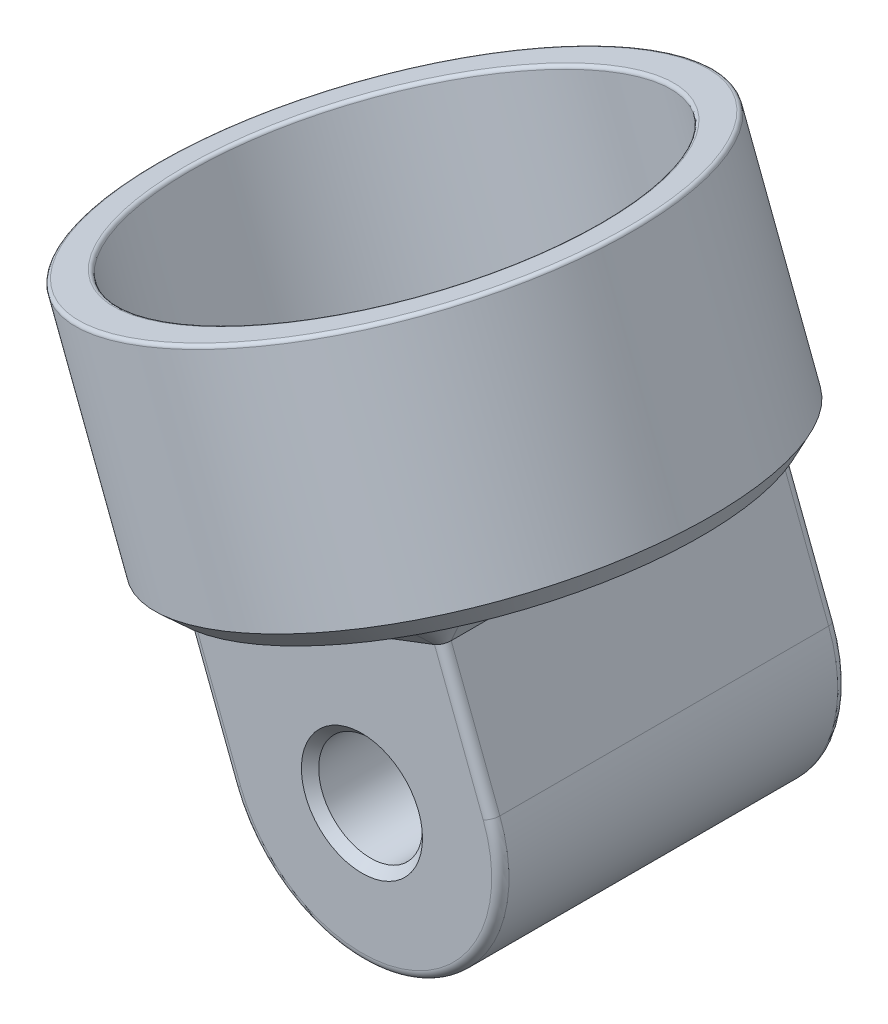
ISO-10303-21;
HEADER;
FILE_DESCRIPTION(('STEP AP214'),'2;1');
FILE_NAME('part.step','',(''),(''),'','','');
FILE_SCHEMA(('AUTOMOTIVE_DESIGN { 1 0 10303 214 1 1 1 1 }'));
ENDSEC;
DATA;
#1=APPLICATION_CONTEXT('core data for automotive mechanical design processes');
#2=APPLICATION_PROTOCOL_DEFINITION('international standard','automotive_design',2000,#1);
#3=PRODUCT_CONTEXT('',#1,'mechanical');
#4=PRODUCT('Part','Part','',(#3));
#5=PRODUCT_RELATED_PRODUCT_CATEGORY('part','',(#4));
#6=PRODUCT_DEFINITION_FORMATION('','',#4);
#7=PRODUCT_DEFINITION_CONTEXT('part definition',#1,'design');
#8=PRODUCT_DEFINITION('design','',#6,#7);
#9=PRODUCT_DEFINITION_SHAPE('','',#8);
#10=(LENGTH_UNIT() NAMED_UNIT(*) SI_UNIT(.MILLI.,.METRE.));
#11=(NAMED_UNIT(*) PLANE_ANGLE_UNIT() SI_UNIT($,.RADIAN.));
#12=(NAMED_UNIT(*) SI_UNIT($,.STERADIAN.) SOLID_ANGLE_UNIT());
#13=UNCERTAINTY_MEASURE_WITH_UNIT(LENGTH_MEASURE(1.E-05),#10,'distance_accuracy_value','');
#14=(GEOMETRIC_REPRESENTATION_CONTEXT(3) GLOBAL_UNCERTAINTY_ASSIGNED_CONTEXT((#13)) GLOBAL_UNIT_ASSIGNED_CONTEXT((#10,
#11,#12)) REPRESENTATION_CONTEXT('',''));
#15=CARTESIAN_POINT('',(0.,0.,0.));
#16=DIRECTION('',(0.,0.,1.));
#17=DIRECTION('',(1.,0.,0.));
#18=AXIS2_PLACEMENT_3D('',#15,#16,#17);
#19=CARTESIAN_POINT('',(98.3545557526425,58.5746602409925,0.));
#20=DIRECTION('',(-0.356881721547672,0.934149579470638,0.));
#21=DIRECTION('',(-0.934149579470638,-0.356881721547672,0.));
#22=AXIS2_PLACEMENT_3D('',#19,#20,#21);
#23=PLANE('',#22);
#24=CARTESIAN_POINT('',(98.3545557526429,58.5746602409927,0.));
#25=DIRECTION('',(-0.356881721547672,0.934149579470638,0.));
#26=DIRECTION('',(-0.934149579470638,-0.356881721547672,0.));
#27=AXIS2_PLACEMENT_3D('',#24,#25,#26);
#28=CIRCLE('',#27,13.6999999999999);
#29=CARTESIAN_POINT('',(85.5567065138952,53.6853806557896,0.));
#30=VERTEX_POINT('',#29);
#31=EDGE_CURVE('E239',#30,#30,#28,.F.);
#32=ORIENTED_EDGE('',*,*,#31,.T.);
#33=EDGE_LOOP('',(#32));
#34=FACE_BOUND('',#33,.T.);
#35=DIRECTION('',(0.934149579470638,0.356881721547672,0.));
#36=VECTOR('',#35,1.);
#37=CARTESIAN_POINT('',(98.3545557526425,58.5746602409925,11.));
#38=LINE('',#37,#36);
#39=CARTESIAN_POINT('',(91.3484339066134,55.8980473293853,10.9999999999999));
#40=VERTEX_POINT('',#39);
#41=CARTESIAN_POINT('',(105.360677598673,61.2512731526003,11.));
#42=VERTEX_POINT('',#41);
#43=EDGE_CURVE('E234',#40,#42,#38,.T.);
#44=ORIENTED_EDGE('',*,*,#43,.T.);
#45=CARTESIAN_POINT('',(105.360677598673,61.2512731526003,9.5));
#46=DIRECTION('',(-0.356881721547672,0.934149579470638,0.));
#47=DIRECTION('',(-0.934149579470638,-0.356881721547672,0.));
#48=AXIS2_PLACEMENT_3D('',#45,#46,#47);
#49=CIRCLE('',#48,1.49999999999995);
#50=CARTESIAN_POINT('',(106.761901967879,61.7865957349218,9.5));
#51=VERTEX_POINT('',#50);
#52=EDGE_CURVE('E236',#42,#51,#49,.T.);
#53=ORIENTED_EDGE('',*,*,#52,.T.);
#54=DIRECTION('',(0.,0.,-1.));
#55=VECTOR('',#54,1.);
#56=CARTESIAN_POINT('',(106.761901967879,61.7865957349218,0.));
#57=LINE('',#56,#55);
#58=CARTESIAN_POINT('',(106.761901967879,61.7865957349218,-9.5));
#59=VERTEX_POINT('',#58);
#60=EDGE_CURVE('E222',#51,#59,#57,.T.);
#61=ORIENTED_EDGE('',*,*,#60,.T.);
#62=CARTESIAN_POINT('',(105.360677598673,61.2512731526003,-9.5));
#63=DIRECTION('',(-0.356881721547672,0.934149579470638,0.));
#64=DIRECTION('',(-0.934149579470638,-0.356881721547672,0.));
#65=AXIS2_PLACEMENT_3D('',#62,#63,#64);
#66=CIRCLE('',#65,1.49999999999998);
#67=CARTESIAN_POINT('',(105.360677598673,61.2512731526003,-11.));
#68=VERTEX_POINT('',#67);
#69=EDGE_CURVE('E224',#59,#68,#66,.T.);
#70=ORIENTED_EDGE('',*,*,#69,.T.);
#71=DIRECTION('',(-0.934149579470638,-0.356881721547672,0.));
#72=VECTOR('',#71,1.);
#73=CARTESIAN_POINT('',(91.3484339066134,55.8980473293853,-11.));
#74=LINE('',#73,#72);
#75=CARTESIAN_POINT('',(91.3484339066134,55.8980473293853,-11.));
#76=VERTEX_POINT('',#75);
#77=EDGE_CURVE('E226',#68,#76,#74,.T.);
#78=ORIENTED_EDGE('',*,*,#77,.T.);
#79=CARTESIAN_POINT('',(91.3484339066134,55.8980473293853,-9.5));
#80=DIRECTION('',(-0.356881721547672,0.934149579470638,0.));
#81=DIRECTION('',(-0.934149579470638,-0.356881721547672,0.));
#82=AXIS2_PLACEMENT_3D('',#79,#80,#81);
#83=CIRCLE('',#82,1.49999999999998);
#84=CARTESIAN_POINT('',(89.9472095374074,55.3627247470638,-9.5));
#85=VERTEX_POINT('',#84);
#86=EDGE_CURVE('E228',#76,#85,#83,.T.);
#87=ORIENTED_EDGE('',*,*,#86,.T.);
#88=DIRECTION('',(0.,0.,1.));
#89=VECTOR('',#88,1.);
#90=CARTESIAN_POINT('',(89.9472095374075,55.3627247470638,0.));
#91=LINE('',#90,#89);
#92=CARTESIAN_POINT('',(89.9472095374075,55.3627247470638,9.5));
#93=VERTEX_POINT('',#92);
#94=EDGE_CURVE('E230',#85,#93,#91,.T.);
#95=ORIENTED_EDGE('',*,*,#94,.T.);
#96=CARTESIAN_POINT('',(91.3484339066134,55.8980473293853,9.5));
#97=DIRECTION('',(-0.356881721547672,0.934149579470638,0.));
#98=DIRECTION('',(-0.934149579470638,-0.356881721547672,0.));
#99=AXIS2_PLACEMENT_3D('',#96,#97,#98);
#100=CIRCLE('',#99,1.49999999999995);
#101=EDGE_CURVE('E232',#93,#40,#100,.T.);
#102=ORIENTED_EDGE('',*,*,#101,.T.);
#103=EDGE_LOOP('',(#44,#53,#61,#70,#78,#87,#95,#102));
#104=FACE_BOUND('',#103,.T.);
#105=ADVANCED_FACE('F45',(#34,#104),#23,.F.);
#106=CARTESIAN_POINT('',(94.0512696439094,47.4222619788342,-10.));
#107=DIRECTION('',(-0.934149579470634,-0.356881721547683,0.));
#108=DIRECTION('',(0.356881721547683,-0.934149579470634,0.));
#109=AXIS2_PLACEMENT_3D('',#106,#107,#108);
#110=PLANE('',#109);
#111=DIRECTION('',(0.356881721547683,-0.934149579470634,0.));
#112=VECTOR('',#111,1.);
#113=CARTESIAN_POINT('',(94.0512696439094,47.4222619788342,9.5));
#114=LINE('',#113,#112);
#115=CARTESIAN_POINT('',(94.0512696439094,47.4222619788342,9.5));
#116=VERTEX_POINT('',#115);
#117=CARTESIAN_POINT('',(91.2382408384257,54.7854568891408,9.5));
#118=VERTEX_POINT('',#117);
#119=EDGE_CURVE('E148',#116,#118,#114,.F.);
#120=ORIENTED_EDGE('',*,*,#119,.T.);
#121=DIRECTION('',(0.,0.,-1.));
#122=VECTOR('',#121,1.);
#123=CARTESIAN_POINT('',(91.2382408384257,54.7854568891408,-10.));
#124=LINE('',#123,#122);
#125=CARTESIAN_POINT('',(91.2382408384257,54.7854568891408,-9.5));
#126=VERTEX_POINT('',#125);
#127=EDGE_CURVE('E249',#118,#126,#124,.T.);
#128=ORIENTED_EDGE('',*,*,#127,.T.);
#129=DIRECTION('',(0.356881721547683,-0.934149579470634,0.));
#130=VECTOR('',#129,1.);
#131=CARTESIAN_POINT('',(94.0512696439094,47.4222619788342,-9.5));
#132=LINE('',#131,#130);
#133=CARTESIAN_POINT('',(94.0512696439094,47.4222619788342,-9.5));
#134=VERTEX_POINT('',#133);
#135=EDGE_CURVE('E180',#126,#134,#132,.T.);
#136=ORIENTED_EDGE('',*,*,#135,.T.);
#137=DIRECTION('',(0.,0.,1.));
#138=VECTOR('',#137,1.);
#139=CARTESIAN_POINT('',(94.0512696439094,47.4222619788342,-10.));
#140=LINE('',#139,#138);
#141=EDGE_CURVE('E143',#134,#116,#140,.T.);
#142=ORIENTED_EDGE('',*,*,#141,.T.);
#143=EDGE_LOOP('',(#120,#128,#136,#142));
#144=FACE_BOUND('',#143,.T.);
#145=ADVANCED_FACE('F328',(#144),#110,.T.);
#146=CARTESIAN_POINT('',(108.99766291544,53.1323695235971,-10.));
#147=DIRECTION('',(0.934149579470634,0.356881721547684,0.));
#148=DIRECTION('',(-0.356881721547684,0.934149579470634,0.));
#149=AXIS2_PLACEMENT_3D('',#146,#147,#148);
#150=PLANE('',#149);
#151=DIRECTION('',(-0.356881721547684,0.934149579470634,0.));
#152=VECTOR('',#151,1.);
#153=CARTESIAN_POINT('',(105.827752388408,61.4297140133742,-9.5));
#154=LINE('',#153,#152);
#155=CARTESIAN_POINT('',(108.99766291544,53.1323695235971,-9.5));
#156=VERTEX_POINT('',#155);
#157=CARTESIAN_POINT('',(106.184634109956,60.4955644339036,-9.5));
#158=VERTEX_POINT('',#157);
#159=EDGE_CURVE('E153',#156,#158,#154,.T.);
#160=ORIENTED_EDGE('',*,*,#159,.T.);
#161=DIRECTION('',(0.,0.,1.));
#162=VECTOR('',#161,1.);
#163=CARTESIAN_POINT('',(106.184634109956,60.4955644339036,-10.));
#164=LINE('',#163,#162);
#165=CARTESIAN_POINT('',(106.184634109956,60.4955644339036,9.5));
#166=VERTEX_POINT('',#165);
#167=EDGE_CURVE('E13',#158,#166,#164,.T.);
#168=ORIENTED_EDGE('',*,*,#167,.T.);
#169=DIRECTION('',(-0.356881721547684,0.934149579470634,0.));
#170=VECTOR('',#169,1.);
#171=CARTESIAN_POINT('',(108.99766291544,53.1323695235971,9.5));
#172=LINE('',#171,#170);
#173=CARTESIAN_POINT('',(108.99766291544,53.1323695235971,9.5));
#174=VERTEX_POINT('',#173);
#175=EDGE_CURVE('E156',#166,#174,#172,.F.);
#176=ORIENTED_EDGE('',*,*,#175,.T.);
#177=DIRECTION('',(0.,0.,1.));
#178=VECTOR('',#177,1.);
#179=CARTESIAN_POINT('',(108.99766291544,53.1323695235971,-10.));
#180=LINE('',#179,#178);
#181=EDGE_CURVE('E140',#156,#174,#180,.T.);
#182=ORIENTED_EDGE('',*,*,#181,.F.);
#183=EDGE_LOOP('',(#160,#168,#176,#182));
#184=FACE_BOUND('',#183,.T.);
#185=ADVANCED_FACE('F152',(#184),#150,.T.);
#186=CARTESIAN_POINT('',(101.524466279675,50.2773157512156,-10.));
#187=DIRECTION('',(0.,0.,1.));
#188=DIRECTION('',(1.,0.,0.));
#189=AXIS2_PLACEMENT_3D('',#186,#187,#188);
#190=PLANE('',#189);
#191=CARTESIAN_POINT('',(101.524466279675,50.2773157512156,-10.));
#192=DIRECTION('',(0.,0.,1.));
#193=DIRECTION('',(1.,0.,0.));
#194=AXIS2_PLACEMENT_3D('',#191,#192,#193);
#195=CIRCLE('',#194,3.5);
#196=CARTESIAN_POINT('',(105.024466279675,50.2773157512156,-10.));
#197=VERTEX_POINT('',#196);
#198=EDGE_CURVE('E204',#197,#197,#195,.T.);
#199=ORIENTED_EDGE('',*,*,#198,.T.);
#200=EDGE_LOOP('',(#199));
#201=FACE_BOUND('',#200,.T.);
#202=DIRECTION('',(0.356881721547683,-0.934149579470634,0.));
#203=VECTOR('',#202,1.);
#204=CARTESIAN_POINT('',(91.3484339066134,55.8980473293853,-10.));
#205=LINE('',#204,#203);
#206=CARTESIAN_POINT('',(94.5183444336447,47.600702839608,-10.));
#207=VERTEX_POINT('',#206);
#208=CARTESIAN_POINT('',(91.7053156281611,54.9638977499147,-10.));
#209=VERTEX_POINT('',#208);
#210=EDGE_CURVE('E167',#207,#209,#205,.F.);
#211=ORIENTED_EDGE('',*,*,#210,.T.);
#212=DIRECTION('',(0.934149579470638,0.356881721547672,0.));
#213=VECTOR('',#212,1.);
#214=CARTESIAN_POINT('',(105.717559320221,60.3171235731297,-10.));
#215=LINE('',#214,#213);
#216=CARTESIAN_POINT('',(105.717559320221,60.3171235731297,-10.));
#217=VERTEX_POINT('',#216);
#218=EDGE_CURVE('E69',#209,#217,#215,.T.);
#219=ORIENTED_EDGE('',*,*,#218,.T.);
#220=DIRECTION('',(-0.356881721547684,0.934149579470634,0.));
#221=VECTOR('',#220,1.);
#222=CARTESIAN_POINT('',(108.530588125704,52.9539286628233,-10.));
#223=LINE('',#222,#221);
#224=CARTESIAN_POINT('',(108.530588125704,52.9539286628233,-10.));
#225=VERTEX_POINT('',#224);
#226=EDGE_CURVE('E175',#217,#225,#223,.F.);
#227=ORIENTED_EDGE('',*,*,#226,.T.);
#228=CARTESIAN_POINT('',(101.524466279675,50.2773157512156,-10.));
#229=DIRECTION('',(0.,0.,1.));
#230=DIRECTION('',(1.,0.,0.));
#231=AXIS2_PLACEMENT_3D('',#228,#229,#230);
#232=CIRCLE('',#231,7.50000000000002);
#233=EDGE_CURVE('E163',#225,#207,#232,.F.);
#234=ORIENTED_EDGE('',*,*,#233,.T.);
#235=EDGE_LOOP('',(#211,#219,#227,#234));
#236=FACE_BOUND('',#235,.T.);
#237=ADVANCED_FACE('F289',(#201,#236),#190,.F.);
#238=CARTESIAN_POINT('',(101.524466279675,50.2773157512156,10.));
#239=DIRECTION('',(0.,0.,1.));
#240=DIRECTION('',(1.,0.,0.));
#241=AXIS2_PLACEMENT_3D('',#238,#239,#240);
#242=PLANE('',#241);
#243=CARTESIAN_POINT('',(101.524466279675,50.2773157512156,10.));
#244=DIRECTION('',(0.,0.,1.));
#245=DIRECTION('',(1.,0.,0.));
#246=AXIS2_PLACEMENT_3D('',#243,#244,#245);
#247=CIRCLE('',#246,3.5);
#248=CARTESIAN_POINT('',(105.024466279675,50.2773157512156,10.));
#249=VERTEX_POINT('',#248);
#250=EDGE_CURVE('E201',#249,#249,#247,.F.);
#251=ORIENTED_EDGE('',*,*,#250,.T.);
#252=EDGE_LOOP('',(#251));
#253=FACE_BOUND('',#252,.T.);
#254=DIRECTION('',(-0.356881721547684,0.934149579470634,0.));
#255=VECTOR('',#254,1.);
#256=CARTESIAN_POINT('',(108.530588125704,52.9539286628233,10.));
#257=LINE('',#256,#255);
#258=CARTESIAN_POINT('',(108.530588125704,52.9539286628233,10.));
#259=VERTEX_POINT('',#258);
#260=CARTESIAN_POINT('',(105.717559320221,60.3171235731297,10.));
#261=VERTEX_POINT('',#260);
#262=EDGE_CURVE('E186',#259,#261,#257,.T.);
#263=ORIENTED_EDGE('',*,*,#262,.T.);
#264=DIRECTION('',(-0.934149579470638,-0.356881721547672,0.));
#265=VECTOR('',#264,1.);
#266=CARTESIAN_POINT('',(98.7114374741909,57.6405106615222,10.));
#267=LINE('',#266,#265);
#268=CARTESIAN_POINT('',(91.7053156281611,54.9638977499147,10.));
#269=VERTEX_POINT('',#268);
#270=EDGE_CURVE('E245',#261,#269,#267,.T.);
#271=ORIENTED_EDGE('',*,*,#270,.T.);
#272=DIRECTION('',(0.356881721547683,-0.934149579470634,0.));
#273=VECTOR('',#272,1.);
#274=CARTESIAN_POINT('',(94.5183444336447,47.600702839608,10.));
#275=LINE('',#274,#273);
#276=CARTESIAN_POINT('',(94.5183444336447,47.600702839608,10.));
#277=VERTEX_POINT('',#276);
#278=EDGE_CURVE('E182',#269,#277,#275,.T.);
#279=ORIENTED_EDGE('',*,*,#278,.T.);
#280=CARTESIAN_POINT('',(101.524466279675,50.2773157512156,10.));
#281=DIRECTION('',(0.,0.,1.));
#282=DIRECTION('',(1.,0.,0.));
#283=AXIS2_PLACEMENT_3D('',#280,#281,#282);
#284=CIRCLE('',#283,7.50000000000002);
#285=EDGE_CURVE('E184',#277,#259,#284,.T.);
#286=ORIENTED_EDGE('',*,*,#285,.T.);
#287=EDGE_LOOP('',(#263,#271,#279,#286));
#288=FACE_BOUND('',#287,.T.);
#289=ADVANCED_FACE('F316',(#253,#288),#242,.T.);
#290=CARTESIAN_POINT('',(101.524466279675,50.2773157512156,-10.));
#291=DIRECTION('',(0.,0.,1.));
#292=DIRECTION('',(1.,0.,0.));
#293=AXIS2_PLACEMENT_3D('',#290,#291,#292);
#294=CYLINDRICAL_SURFACE('',#293,8.00000000000002);
#295=ORIENTED_EDGE('',*,*,#141,.F.);
#296=CARTESIAN_POINT('',(101.524466279675,50.2773157512156,-9.5));
#297=DIRECTION('',(0.,0.,1.));
#298=DIRECTION('',(1.,0.,0.));
#299=AXIS2_PLACEMENT_3D('',#296,#297,#298);
#300=CIRCLE('',#299,8.00000000000002);
#301=EDGE_CURVE('E137',#134,#156,#300,.T.);
#302=ORIENTED_EDGE('',*,*,#301,.T.);
#303=ORIENTED_EDGE('',*,*,#181,.T.);
#304=CARTESIAN_POINT('',(101.524466279675,50.2773157512156,9.5));
#305=DIRECTION('',(0.,0.,1.));
#306=DIRECTION('',(1.,0.,0.));
#307=AXIS2_PLACEMENT_3D('',#304,#305,#306);
#308=CIRCLE('',#307,8.00000000000002);
#309=EDGE_CURVE('E149',#174,#116,#308,.F.);
#310=ORIENTED_EDGE('',*,*,#309,.T.);
#311=EDGE_LOOP('',(#295,#302,#303,#310));
#312=FACE_BOUND('',#311,.T.);
#313=ADVANCED_FACE('F139',(#312),#294,.T.);
#314=CARTESIAN_POINT('',(101.524466279675,50.2773157512156,-10.));
#315=DIRECTION('',(0.,0.,1.));
#316=DIRECTION('',(1.,0.,0.));
#317=AXIS2_PLACEMENT_3D('',#314,#315,#316);
#318=CYLINDRICAL_SURFACE('',#317,3.00000000000001);
#319=CARTESIAN_POINT('',(101.524466279675,50.2773157512156,9.50000000000001));
#320=DIRECTION('',(0.,0.,1.));
#321=DIRECTION('',(1.,0.,0.));
#322=AXIS2_PLACEMENT_3D('',#319,#320,#321);
#323=CIRCLE('',#322,3.00000000000001);
#324=CARTESIAN_POINT('',(104.524466279675,50.2773157512156,9.50000000000001));
#325=VERTEX_POINT('',#324);
#326=EDGE_CURVE('E198',#325,#325,#323,.T.);
#327=ORIENTED_EDGE('',*,*,#326,.T.);
#328=EDGE_LOOP('',(#327));
#329=FACE_BOUND('',#328,.T.);
#330=CARTESIAN_POINT('',(101.524466279675,50.2773157512156,-9.50000000000001));
#331=DIRECTION('',(0.,0.,1.));
#332=DIRECTION('',(1.,0.,0.));
#333=AXIS2_PLACEMENT_3D('',#330,#331,#332);
#334=CIRCLE('',#333,3.00000000000001);
#335=CARTESIAN_POINT('',(104.524466279675,50.2773157512156,-9.50000000000001));
#336=VERTEX_POINT('',#335);
#337=EDGE_CURVE('E188',#336,#336,#334,.F.);
#338=ORIENTED_EDGE('',*,*,#337,.T.);
#339=EDGE_LOOP('',(#338));
#340=FACE_BOUND('',#339,.T.);
#341=ADVANCED_FACE('F343',(#329,#340),#318,.F.);
#342=CARTESIAN_POINT('',(94.5183444336447,47.600702839608,-9.5));
#343=DIRECTION('',(-0.356881721547683,0.934149579470634,0.));
#344=DIRECTION('',(-0.934149579470634,-0.356881721547683,0.));
#345=AXIS2_PLACEMENT_3D('',#342,#343,#344);
#346=CYLINDRICAL_SURFACE('',#345,0.5);
#347=ORIENTED_EDGE('',*,*,#135,.F.);
#348=CARTESIAN_POINT('',(91.7053156281611,54.9638977499147,-9.5));
#349=DIRECTION('',(-0.356881721547683,0.934149579470634,0.));
#350=DIRECTION('',(-0.934149579470634,-0.356881721547683,0.));
#351=AXIS2_PLACEMENT_3D('',#348,#349,#350);
#352=CIRCLE('',#351,0.5);
#353=EDGE_CURVE('E251',#126,#209,#352,.F.);
#354=ORIENTED_EDGE('',*,*,#353,.T.);
#355=ORIENTED_EDGE('',*,*,#210,.F.);
#356=CARTESIAN_POINT('',(94.5183444336447,47.600702839608,-9.5));
#357=DIRECTION('',(0.356881721547686,-0.934149579470633,0.));
#358=DIRECTION('',(0.934149579470633,0.356881721547686,0.));
#359=AXIS2_PLACEMENT_3D('',#356,#357,#358);
#360=CIRCLE('',#359,0.5);
#361=EDGE_CURVE('E157',#134,#207,#360,.T.);
#362=ORIENTED_EDGE('',*,*,#361,.F.);
#363=EDGE_LOOP('',(#347,#354,#355,#362));
#364=FACE_BOUND('',#363,.T.);
#365=ADVANCED_FACE('F288',(#364),#346,.T.);
#366=CARTESIAN_POINT('',(101.524466279675,50.2773157512156,-9.5));
#367=DIRECTION('',(0.,0.,1.));
#368=DIRECTION('',(1.,0.,0.));
#369=AXIS2_PLACEMENT_3D('',#366,#367,#368);
#370=TOROIDAL_SURFACE('',#369,7.50000000000002,0.5);
#371=ORIENTED_EDGE('',*,*,#361,.T.);
#372=ORIENTED_EDGE('',*,*,#233,.F.);
#373=CARTESIAN_POINT('',(108.530588125704,52.9539286628233,-9.5));
#374=DIRECTION('',(-0.356881721547686,0.934149579470633,0.));
#375=DIRECTION('',(-0.934149579470633,-0.356881721547686,0.));
#376=AXIS2_PLACEMENT_3D('',#373,#374,#375);
#377=CIRCLE('',#376,0.5);
#378=EDGE_CURVE('E161',#156,#225,#377,.T.);
#379=ORIENTED_EDGE('',*,*,#378,.F.);
#380=ORIENTED_EDGE('',*,*,#301,.F.);
#381=EDGE_LOOP('',(#371,#372,#379,#380));
#382=FACE_BOUND('',#381,.T.);
#383=ADVANCED_FACE('F162',(#382),#370,.T.);
#384=CARTESIAN_POINT('',(108.530588125704,52.9539286628233,-9.5));
#385=DIRECTION('',(0.356881721547684,-0.934149579470634,0.));
#386=DIRECTION('',(0.934149579470634,0.356881721547684,0.));
#387=AXIS2_PLACEMENT_3D('',#384,#385,#386);
#388=CYLINDRICAL_SURFACE('',#387,0.5);
#389=ORIENTED_EDGE('',*,*,#226,.F.);
#390=CARTESIAN_POINT('',(105.717559320221,60.3171235731297,-9.5));
#391=DIRECTION('',(-0.356881721547683,0.934149579470634,0.));
#392=DIRECTION('',(-0.934149579470634,-0.356881721547683,0.));
#393=AXIS2_PLACEMENT_3D('',#390,#391,#392);
#394=CIRCLE('',#393,0.5);
#395=EDGE_CURVE('E54',#217,#158,#394,.F.);
#396=ORIENTED_EDGE('',*,*,#395,.T.);
#397=ORIENTED_EDGE('',*,*,#159,.F.);
#398=ORIENTED_EDGE('',*,*,#378,.T.);
#399=EDGE_LOOP('',(#389,#396,#397,#398));
#400=FACE_BOUND('',#399,.T.);
#401=ADVANCED_FACE('F166',(#400),#388,.T.);
#402=CARTESIAN_POINT('',(94.5183444336447,47.600702839608,9.5));
#403=DIRECTION('',(0.356881721547683,-0.934149579470634,0.));
#404=DIRECTION('',(0.934149579470634,0.356881721547683,0.));
#405=AXIS2_PLACEMENT_3D('',#402,#403,#404);
#406=CYLINDRICAL_SURFACE('',#405,0.5);
#407=ORIENTED_EDGE('',*,*,#278,.F.);
#408=CARTESIAN_POINT('',(91.7053156281611,54.9638977499147,9.5));
#409=DIRECTION('',(-0.356881721547688,0.934149579470632,0.));
#410=DIRECTION('',(-0.934149579470632,-0.356881721547688,0.));
#411=AXIS2_PLACEMENT_3D('',#408,#409,#410);
#412=CIRCLE('',#411,0.5);
#413=EDGE_CURVE('E247',#269,#118,#412,.F.);
#414=ORIENTED_EDGE('',*,*,#413,.T.);
#415=ORIENTED_EDGE('',*,*,#119,.F.);
#416=CARTESIAN_POINT('',(94.5183444336447,47.600702839608,9.5));
#417=DIRECTION('',(0.356881721547686,-0.934149579470633,0.));
#418=DIRECTION('',(0.934149579470633,0.356881721547686,0.));
#419=AXIS2_PLACEMENT_3D('',#416,#417,#418);
#420=CIRCLE('',#419,0.5);
#421=EDGE_CURVE('E164',#277,#116,#420,.T.);
#422=ORIENTED_EDGE('',*,*,#421,.F.);
#423=EDGE_LOOP('',(#407,#414,#415,#422));
#424=FACE_BOUND('',#423,.T.);
#425=ADVANCED_FACE('F320',(#424),#406,.T.);
#426=CARTESIAN_POINT('',(101.524466279675,50.2773157512156,9.5));
#427=DIRECTION('',(0.,0.,1.));
#428=DIRECTION('',(1.,0.,0.));
#429=AXIS2_PLACEMENT_3D('',#426,#427,#428);
#430=TOROIDAL_SURFACE('',#429,7.50000000000002,0.5);
#431=ORIENTED_EDGE('',*,*,#421,.T.);
#432=ORIENTED_EDGE('',*,*,#309,.F.);
#433=CARTESIAN_POINT('',(108.530588125704,52.9539286628233,9.5));
#434=DIRECTION('',(-0.356881721547686,0.934149579470633,0.));
#435=DIRECTION('',(-0.934149579470633,-0.356881721547686,0.));
#436=AXIS2_PLACEMENT_3D('',#433,#434,#435);
#437=CIRCLE('',#436,0.5);
#438=EDGE_CURVE('E191',#259,#174,#437,.T.);
#439=ORIENTED_EDGE('',*,*,#438,.F.);
#440=ORIENTED_EDGE('',*,*,#285,.F.);
#441=EDGE_LOOP('',(#431,#432,#439,#440));
#442=FACE_BOUND('',#441,.T.);
#443=ADVANCED_FACE('F363',(#442),#430,.T.);
#444=CARTESIAN_POINT('',(108.530588125704,52.9539286628233,9.5));
#445=DIRECTION('',(-0.356881721547684,0.934149579470634,0.));
#446=DIRECTION('',(-0.934149579470634,-0.356881721547684,0.));
#447=AXIS2_PLACEMENT_3D('',#444,#445,#446);
#448=CYLINDRICAL_SURFACE('',#447,0.5);
#449=ORIENTED_EDGE('',*,*,#175,.F.);
#450=CARTESIAN_POINT('',(105.717559320221,60.3171235731297,9.5));
#451=DIRECTION('',(-0.356881721547683,0.934149579470634,0.));
#452=DIRECTION('',(-0.934149579470634,-0.356881721547683,0.));
#453=AXIS2_PLACEMENT_3D('',#450,#451,#452);
#454=CIRCLE('',#453,0.5);
#455=EDGE_CURVE('E242',#166,#261,#454,.F.);
#456=ORIENTED_EDGE('',*,*,#455,.T.);
#457=ORIENTED_EDGE('',*,*,#262,.F.);
#458=ORIENTED_EDGE('',*,*,#438,.T.);
#459=EDGE_LOOP('',(#449,#456,#457,#458));
#460=FACE_BOUND('',#459,.T.);
#461=ADVANCED_FACE('F302',(#460),#448,.T.);
#462=CARTESIAN_POINT('',(101.524466279675,50.2773157512156,9.50000000000001));
#463=DIRECTION('',(0.,0.,1.));
#464=DIRECTION('',(1.,0.,0.));
#465=AXIS2_PLACEMENT_3D('',#462,#463,#464);
#466=CONICAL_SURFACE('',#465,3.00000000000001,0.785398163397453);
#467=ORIENTED_EDGE('',*,*,#250,.F.);
#468=EDGE_LOOP('',(#467));
#469=FACE_BOUND('',#468,.T.);
#470=ORIENTED_EDGE('',*,*,#326,.F.);
#471=EDGE_LOOP('',(#470));
#472=FACE_BOUND('',#471,.T.);
#473=ADVANCED_FACE('F362',(#469,#472),#466,.F.);
#474=CARTESIAN_POINT('',(101.524466279675,50.2773157512156,-10.));
#475=DIRECTION('',(0.,0.,-1.));
#476=DIRECTION('',(-1.,0.,0.));
#477=AXIS2_PLACEMENT_3D('',#474,#475,#476);
#478=CONICAL_SURFACE('',#477,3.5,0.785398163397451);
#479=ORIENTED_EDGE('',*,*,#337,.F.);
#480=EDGE_LOOP('',(#479));
#481=FACE_BOUND('',#480,.T.);
#482=ORIENTED_EDGE('',*,*,#198,.F.);
#483=EDGE_LOOP('',(#482));
#484=FACE_BOUND('',#483,.T.);
#485=ADVANCED_FACE('F371',(#481,#484),#478,.F.);
#486=CARTESIAN_POINT('',(105.65572687506,39.4636060125165,0.));
#487=DIRECTION('',(-0.356881721547672,0.934149579470638,0.));
#488=DIRECTION('',(-0.934149579470638,-0.356881721547672,0.));
#489=AXIS2_PLACEMENT_3D('',#486,#487,#488);
#490=CYLINDRICAL_SURFACE('',#489,14.7);
#491=CARTESIAN_POINT('',(97.9976740310952,59.5088098204634,0.));
#492=DIRECTION('',(-0.35688172154767,0.934149579470639,0.));
#493=DIRECTION('',(-0.934149579470639,-0.35688172154767,0.));
#494=AXIS2_PLACEMENT_3D('',#491,#492,#493);
#495=CIRCLE('',#494,14.7);
#496=CARTESIAN_POINT('',(84.2656752128768,54.2626485137126,0.));
#497=VERTEX_POINT('',#496);
#498=EDGE_CURVE('E219',#497,#497,#495,.T.);
#499=ORIENTED_EDGE('',*,*,#498,.T.);
#500=EDGE_LOOP('',(#499));
#501=FACE_BOUND('',#500,.T.);
#502=CARTESIAN_POINT('',(93.429587995285,71.4659244376875,0.));
#503=DIRECTION('',(-0.356881721547672,0.934149579470638,0.));
#504=DIRECTION('',(-0.934149579470638,-0.356881721547672,0.));
#505=AXIS2_PLACEMENT_3D('',#502,#503,#504);
#506=CIRCLE('',#505,14.7);
#507=CARTESIAN_POINT('',(79.6975891770667,66.2197631309368,0.));
#508=VERTEX_POINT('',#507);
#509=EDGE_CURVE('E213',#508,#508,#506,.F.);
#510=ORIENTED_EDGE('',*,*,#509,.T.);
#511=EDGE_LOOP('',(#510));
#512=FACE_BOUND('',#511,.T.);
#513=ADVANCED_FACE('F375',(#501,#512),#490,.T.);
#514=CARTESIAN_POINT('',(96.9270288664518,62.3112585588751,0.));
#515=DIRECTION('',(-0.356881721547672,0.934149579470638,0.));
#516=DIRECTION('',(-0.934149579470638,-0.356881721547672,0.));
#517=AXIS2_PLACEMENT_3D('',#514,#515,#516);
#518=PLANE('',#517);
#519=CARTESIAN_POINT('',(96.9270288664522,62.3112585588752,0.));
#520=DIRECTION('',(-0.356881721547672,0.934149579470638,0.));
#521=DIRECTION('',(-0.934149579470638,-0.356881721547672,0.));
#522=AXIS2_PLACEMENT_3D('',#519,#520,#521);
#523=CIRCLE('',#522,12.7);
#524=CARTESIAN_POINT('',(85.0633292071751,57.7788606952198,0.));
#525=VERTEX_POINT('',#524);
#526=EDGE_CURVE('E170',#525,#525,#523,.F.);
#527=ORIENTED_EDGE('',*,*,#526,.F.);
#528=EDGE_LOOP('',(#527));
#529=FACE_BOUND('',#528,.T.);
#530=ADVANCED_FACE('F338',(#529),#518,.T.);
#531=CARTESIAN_POINT('',(93.3582116509755,71.6527543535817,0.));
#532=DIRECTION('',(0.356881721547672,-0.934149579470638,0.));
#533=DIRECTION('',(0.934149579470638,0.356881721547672,0.));
#534=AXIS2_PLACEMENT_3D('',#531,#532,#533);
#535=CYLINDRICAL_SURFACE('',#534,12.7);
#536=CARTESIAN_POINT('',(93.429587995285,71.4659244376875,0.));
#537=DIRECTION('',(-0.356881721547672,0.934149579470638,0.));
#538=DIRECTION('',(-0.934149579470638,-0.356881721547672,0.));
#539=AXIS2_PLACEMENT_3D('',#536,#537,#538);
#540=CIRCLE('',#539,12.7);
#541=CARTESIAN_POINT('',(81.5658883360079,66.9335265740321,0.));
#542=VERTEX_POINT('',#541);
#543=EDGE_CURVE('E216',#542,#542,#540,.T.);
#544=ORIENTED_EDGE('',*,*,#543,.T.);
#545=EDGE_LOOP('',(#544));
#546=FACE_BOUND('',#545,.T.);
#547=ORIENTED_EDGE('',*,*,#526,.T.);
#548=EDGE_LOOP('',(#547));
#549=FACE_BOUND('',#548,.T.);
#550=ADVANCED_FACE('F426',(#546,#549),#535,.F.);
#551=CARTESIAN_POINT('',(93.3582116509755,71.6527543535817,0.));
#552=DIRECTION('',(-0.356881721547672,0.934149579470638,0.));
#553=DIRECTION('',(-0.934149579470638,-0.356881721547672,0.));
#554=AXIS2_PLACEMENT_3D('',#551,#552,#553);
#555=PLANE('',#554);
#556=CARTESIAN_POINT('',(93.3582116509755,71.6527543535817,0.));
#557=DIRECTION('',(-0.356881721547672,0.934149579470638,0.));
#558=DIRECTION('',(-0.934149579470638,-0.356881721547672,0.));
#559=AXIS2_PLACEMENT_3D('',#556,#557,#558);
#560=CIRCLE('',#559,14.5);
#561=CARTESIAN_POINT('',(79.8130427486513,66.4779693911404,0.));
#562=VERTEX_POINT('',#561);
#563=EDGE_CURVE('E210',#562,#562,#560,.T.);
#564=ORIENTED_EDGE('',*,*,#563,.T.);
#565=EDGE_LOOP('',(#564));
#566=FACE_BOUND('',#565,.T.);
#567=CARTESIAN_POINT('',(93.3582116509755,71.6527543535817,0.));
#568=DIRECTION('',(-0.356881721547672,0.934149579470638,0.));
#569=DIRECTION('',(-0.934149579470638,-0.356881721547672,0.));
#570=AXIS2_PLACEMENT_3D('',#567,#568,#569);
#571=CIRCLE('',#570,12.9);
#572=CARTESIAN_POINT('',(81.3076820758043,67.0489801456167,0.));
#573=VERTEX_POINT('',#572);
#574=EDGE_CURVE('E207',#573,#573,#571,.F.);
#575=ORIENTED_EDGE('',*,*,#574,.T.);
#576=EDGE_LOOP('',(#575));
#577=FACE_BOUND('',#576,.T.);
#578=ADVANCED_FACE('F381',(#566,#577),#555,.T.);
#579=CARTESIAN_POINT('',(93.429587995285,71.4659244376875,0.));
#580=DIRECTION('',(-0.356881721547672,0.934149579470638,0.));
#581=DIRECTION('',(-0.934149579470638,-0.356881721547672,0.));
#582=AXIS2_PLACEMENT_3D('',#579,#580,#581);
#583=TOROIDAL_SURFACE('',#582,14.5,0.2);
#584=ORIENTED_EDGE('',*,*,#509,.F.);
#585=EDGE_LOOP('',(#584));
#586=FACE_BOUND('',#585,.T.);
#587=ORIENTED_EDGE('',*,*,#563,.F.);
#588=EDGE_LOOP('',(#587));
#589=FACE_BOUND('',#588,.T.);
#590=ADVANCED_FACE('F377',(#586,#589),#583,.T.);
#591=CARTESIAN_POINT('',(93.429587995285,71.4659244376875,0.));
#592=DIRECTION('',(-0.356881721547672,0.934149579470638,0.));
#593=DIRECTION('',(-0.934149579470638,-0.356881721547672,0.));
#594=AXIS2_PLACEMENT_3D('',#591,#592,#593);
#595=TOROIDAL_SURFACE('',#594,12.9,0.2);
#596=ORIENTED_EDGE('',*,*,#574,.F.);
#597=EDGE_LOOP('',(#596));
#598=FACE_BOUND('',#597,.T.);
#599=ORIENTED_EDGE('',*,*,#543,.F.);
#600=EDGE_LOOP('',(#599));
#601=FACE_BOUND('',#600,.T.);
#602=ADVANCED_FACE('F380',(#598,#601),#595,.T.);
#603=CARTESIAN_POINT('',(97.9976740310952,59.5088098204634,0.));
#604=DIRECTION('',(-0.35688172154767,0.934149579470639,0.));
#605=DIRECTION('',(-0.934149579470639,-0.35688172154767,0.));
#606=AXIS2_PLACEMENT_3D('',#603,#604,#605);
#607=CONICAL_SURFACE('',#606,14.7,0.785398163397437);
#608=ORIENTED_EDGE('',*,*,#31,.F.);
#609=EDGE_LOOP('',(#608));
#610=FACE_BOUND('',#609,.T.);
#611=ORIENTED_EDGE('',*,*,#498,.F.);
#612=EDGE_LOOP('',(#611));
#613=FACE_BOUND('',#612,.T.);
#614=ADVANCED_FACE('F385',(#610,#613),#607,.T.);
#615=CARTESIAN_POINT('',(91.3484339066134,55.8980473293853,-9.5));
#616=DIRECTION('',(-0.356881721547683,0.934149579470634,0.));
#617=DIRECTION('',(-0.934149579470634,-0.356881721547683,0.));
#618=AXIS2_PLACEMENT_3D('',#615,#616,#617);
#619=CONICAL_SURFACE('',#618,1.49999999999997,0.785398163397449);
#620=DIRECTION('',(-0.252353485387885,0.660543502286245,-0.707106781186554));
#621=VECTOR('',#620,1.);
#622=CARTESIAN_POINT('',(91.7053156281611,54.9638977499147,-10.));
#623=LINE('',#622,#621);
#624=EDGE_CURVE('E270',#209,#76,#623,.T.);
#625=ORIENTED_EDGE('',*,*,#624,.F.);
#626=ORIENTED_EDGE('',*,*,#353,.F.);
#627=DIRECTION('',(0.912896987674143,-0.408190016898351,0.));
#628=VECTOR('',#627,1.);
#629=CARTESIAN_POINT('',(89.9472095374074,55.3627247470638,-9.5));
#630=LINE('',#629,#628);
#631=EDGE_CURVE('E49',#85,#126,#630,.T.);
#632=ORIENTED_EDGE('',*,*,#631,.F.);
#633=ORIENTED_EDGE('',*,*,#86,.F.);
#634=EDGE_LOOP('',(#625,#626,#632,#633));
#635=FACE_BOUND('',#634,.T.);
#636=ADVANCED_FACE('F47',(#635),#619,.T.);
#637=CARTESIAN_POINT('',(91.2382408384257,54.7854568891408,-10.));
#638=DIRECTION('',(0.408190016898355,0.912896987674141,0.));
#639=DIRECTION('',(0.,0.,-1.));
#640=AXIS2_PLACEMENT_3D('',#637,#638,#639);
#641=PLANE('',#640);
#642=ORIENTED_EDGE('',*,*,#631,.T.);
#643=ORIENTED_EDGE('',*,*,#127,.F.);
#644=DIRECTION('',(0.912896987674141,-0.408190016898355,0.));
#645=VECTOR('',#644,1.);
#646=CARTESIAN_POINT('',(89.9472095374075,55.3627247470638,9.5));
#647=LINE('',#646,#645);
#648=EDGE_CURVE('E268',#93,#118,#647,.T.);
#649=ORIENTED_EDGE('',*,*,#648,.F.);
#650=ORIENTED_EDGE('',*,*,#94,.F.);
#651=EDGE_LOOP('',(#642,#643,#649,#650));
#652=FACE_BOUND('',#651,.T.);
#653=ADVANCED_FACE('F280',(#652),#641,.F.);
#654=CARTESIAN_POINT('',(98.3545557526425,58.5746602409925,-11.));
#655=DIRECTION('',(0.252353485387888,-0.660543502286252,-0.707106781186546));
#656=DIRECTION('',(0.934149579470638,0.356881721547672,0.));
#657=AXIS2_PLACEMENT_3D('',#654,#655,#656);
#658=PLANE('',#657);
#659=ORIENTED_EDGE('',*,*,#624,.T.);
#660=ORIENTED_EDGE('',*,*,#77,.F.);
#661=DIRECTION('',(-0.252353485387887,0.660543502286248,-0.707106781186549));
#662=VECTOR('',#661,1.);
#663=CARTESIAN_POINT('',(105.717559320221,60.3171235731297,-10.));
#664=LINE('',#663,#662);
#665=EDGE_CURVE('E265',#217,#68,#664,.T.);
#666=ORIENTED_EDGE('',*,*,#665,.F.);
#667=ORIENTED_EDGE('',*,*,#218,.F.);
#668=EDGE_LOOP('',(#659,#660,#666,#667));
#669=FACE_BOUND('',#668,.T.);
#670=ADVANCED_FACE('F291',(#669),#658,.T.);
#671=CARTESIAN_POINT('',(91.3484339066134,55.8980473293853,9.5));
#672=DIRECTION('',(-0.356881721547688,0.934149579470632,0.));
#673=DIRECTION('',(-0.934149579470632,-0.356881721547688,0.));
#674=AXIS2_PLACEMENT_3D('',#671,#672,#673);
#675=CONICAL_SURFACE('',#674,1.49999999999995,0.785398163397446);
#676=ORIENTED_EDGE('',*,*,#648,.T.);
#677=ORIENTED_EDGE('',*,*,#413,.F.);
#678=DIRECTION('',(0.252353485387891,-0.66054350228625,-0.707106781186546));
#679=VECTOR('',#678,1.);
#680=CARTESIAN_POINT('',(91.3484339066134,55.8980473293853,10.9999999999999));
#681=LINE('',#680,#679);
#682=EDGE_CURVE('E262',#40,#269,#681,.T.);
#683=ORIENTED_EDGE('',*,*,#682,.F.);
#684=ORIENTED_EDGE('',*,*,#101,.F.);
#685=EDGE_LOOP('',(#676,#677,#683,#684));
#686=FACE_BOUND('',#685,.T.);
#687=ADVANCED_FACE('F324',(#686),#675,.T.);
#688=CARTESIAN_POINT('',(105.360677598673,61.2512731526003,-9.5));
#689=DIRECTION('',(-0.356881721547683,0.934149579470634,0.));
#690=DIRECTION('',(-0.934149579470634,-0.356881721547683,0.));
#691=AXIS2_PLACEMENT_3D('',#688,#689,#690);
#692=CONICAL_SURFACE('',#691,1.49999999999998,0.785398163397453);
#693=ORIENTED_EDGE('',*,*,#665,.T.);
#694=ORIENTED_EDGE('',*,*,#69,.F.);
#695=DIRECTION('',(0.408190016898363,0.912896987674137,0.));
#696=VECTOR('',#695,1.);
#697=CARTESIAN_POINT('',(106.184634109956,60.4955644339036,-9.5));
#698=LINE('',#697,#696);
#699=EDGE_CURVE('E259',#158,#59,#698,.T.);
#700=ORIENTED_EDGE('',*,*,#699,.F.);
#701=ORIENTED_EDGE('',*,*,#395,.F.);
#702=EDGE_LOOP('',(#693,#694,#700,#701));
#703=FACE_BOUND('',#702,.T.);
#704=ADVANCED_FACE('F294',(#703),#692,.T.);
#705=CARTESIAN_POINT('',(98.7114374741909,57.6405106615222,10.));
#706=DIRECTION('',(-0.252353485387888,0.660543502286252,-0.707106781186546));
#707=DIRECTION('',(-0.934149579470638,-0.356881721547672,0.));
#708=AXIS2_PLACEMENT_3D('',#705,#706,#707);
#709=PLANE('',#708);
#710=ORIENTED_EDGE('',*,*,#682,.T.);
#711=ORIENTED_EDGE('',*,*,#270,.F.);
#712=DIRECTION('',(0.252353485387897,-0.660543502286244,-0.70710678118655));
#713=VECTOR('',#712,1.);
#714=CARTESIAN_POINT('',(105.360677598673,61.2512731526003,11.));
#715=LINE('',#714,#713);
#716=EDGE_CURVE('E257',#42,#261,#715,.T.);
#717=ORIENTED_EDGE('',*,*,#716,.F.);
#718=ORIENTED_EDGE('',*,*,#43,.F.);
#719=EDGE_LOOP('',(#710,#711,#717,#718));
#720=FACE_BOUND('',#719,.T.);
#721=ADVANCED_FACE('F312',(#720),#709,.F.);
#722=CARTESIAN_POINT('',(106.184634109956,60.4955644339036,-10.));
#723=DIRECTION('',(-0.912896987674135,0.408190016898369,0.));
#724=DIRECTION('',(0.,0.,1.));
#725=AXIS2_PLACEMENT_3D('',#722,#723,#724);
#726=PLANE('',#725);
#727=ORIENTED_EDGE('',*,*,#699,.T.);
#728=ORIENTED_EDGE('',*,*,#60,.F.);
#729=DIRECTION('',(0.408190016898367,0.912896987674135,0.));
#730=VECTOR('',#729,1.);
#731=CARTESIAN_POINT('',(106.184634109956,60.4955644339036,9.5));
#732=LINE('',#731,#730);
#733=EDGE_CURVE('E255',#166,#51,#732,.T.);
#734=ORIENTED_EDGE('',*,*,#733,.F.);
#735=ORIENTED_EDGE('',*,*,#167,.F.);
#736=EDGE_LOOP('',(#727,#728,#734,#735));
#737=FACE_BOUND('',#736,.T.);
#738=ADVANCED_FACE('F299',(#737),#726,.F.);
#739=CARTESIAN_POINT('',(105.360677598673,61.2512731526003,9.5));
#740=DIRECTION('',(-0.356881721547683,0.934149579470634,0.));
#741=DIRECTION('',(-0.934149579470634,-0.356881721547683,0.));
#742=AXIS2_PLACEMENT_3D('',#739,#740,#741);
#743=CONICAL_SURFACE('',#742,1.49999999999997,0.785398163397449);
#744=ORIENTED_EDGE('',*,*,#716,.T.);
#745=ORIENTED_EDGE('',*,*,#455,.F.);
#746=ORIENTED_EDGE('',*,*,#733,.T.);
#747=ORIENTED_EDGE('',*,*,#52,.F.);
#748=EDGE_LOOP('',(#744,#745,#746,#747));
#749=FACE_BOUND('',#748,.T.);
#750=ADVANCED_FACE('F306',(#749),#743,.T.);
#751=CLOSED_SHELL('',(#105,#145,#185,#237,#289,#313,#341,#365,#383,#401,#425,#443,#461,#473,
#485,#513,#530,#550,#578,#590,#602,#614,#636,#653,#670,#687,#704,#721,#738,#750));
#752=MANIFOLD_SOLID_BREP('B2',#751);
#753=ADVANCED_BREP_SHAPE_REPRESENTATION('',(#18,#752),#14);
#754=SHAPE_DEFINITION_REPRESENTATION(#9,#753);
ENDSEC;
END-ISO-10303-21;
